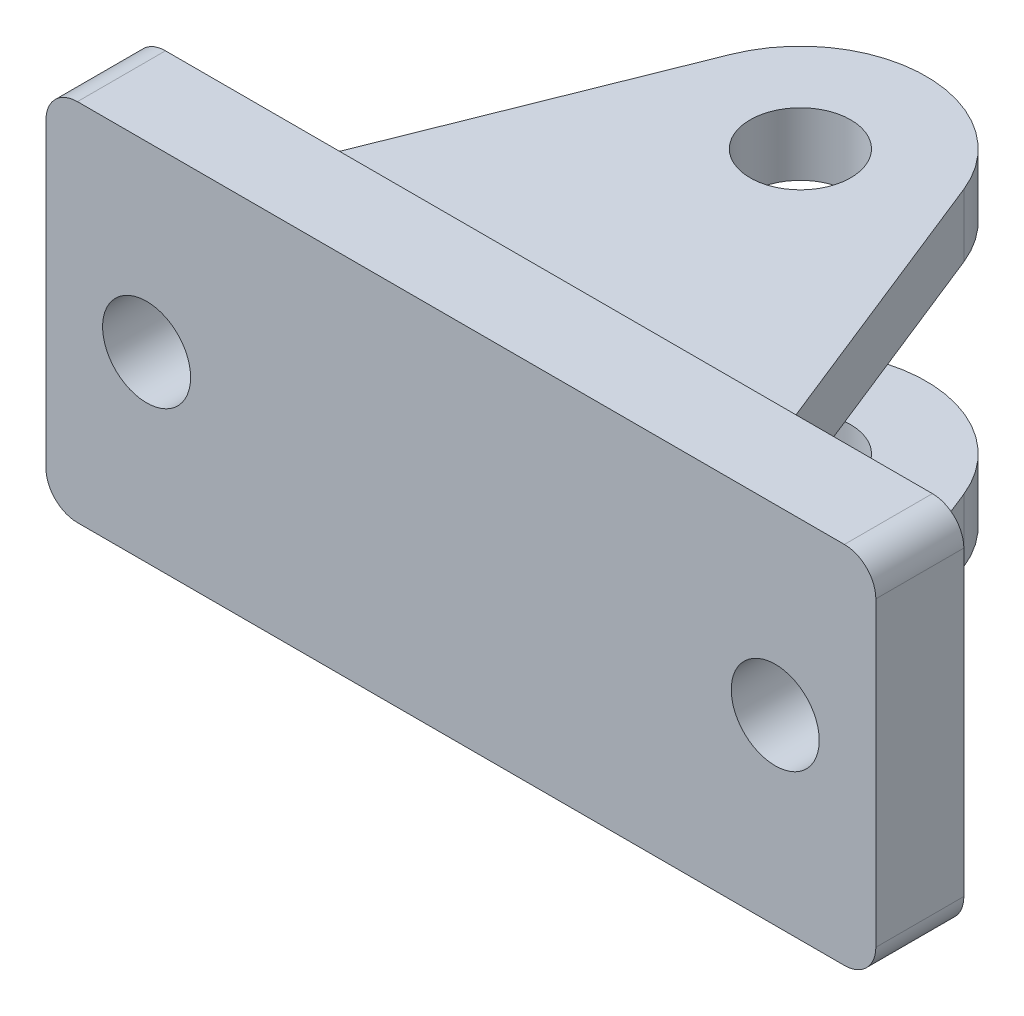
ISO-10303-21;
HEADER;
FILE_DESCRIPTION(('STEP AP214'),'2;1');
FILE_NAME('part.step','',(''),(''),'','','');
FILE_SCHEMA(('AUTOMOTIVE_DESIGN { 1 0 10303 214 1 1 1 1 }'));
ENDSEC;
DATA;
#1=APPLICATION_CONTEXT('core data for automotive mechanical design processes');
#2=APPLICATION_PROTOCOL_DEFINITION('international standard','automotive_design',2000,#1);
#3=PRODUCT_CONTEXT('',#1,'mechanical');
#4=PRODUCT('Part','Part','',(#3));
#5=PRODUCT_RELATED_PRODUCT_CATEGORY('part','',(#4));
#6=PRODUCT_DEFINITION_FORMATION('','',#4);
#7=PRODUCT_DEFINITION_CONTEXT('part definition',#1,'design');
#8=PRODUCT_DEFINITION('design','',#6,#7);
#9=PRODUCT_DEFINITION_SHAPE('','',#8);
#10=(LENGTH_UNIT() NAMED_UNIT(*) SI_UNIT(.MILLI.,.METRE.));
#11=(NAMED_UNIT(*) PLANE_ANGLE_UNIT() SI_UNIT($,.RADIAN.));
#12=(NAMED_UNIT(*) SI_UNIT($,.STERADIAN.) SOLID_ANGLE_UNIT());
#13=UNCERTAINTY_MEASURE_WITH_UNIT(LENGTH_MEASURE(1.E-05),#10,'distance_accuracy_value','');
#14=(GEOMETRIC_REPRESENTATION_CONTEXT(3) GLOBAL_UNCERTAINTY_ASSIGNED_CONTEXT((#13)) GLOBAL_UNIT_ASSIGNED_CONTEXT((#10,
#11,#12)) REPRESENTATION_CONTEXT('',''));
#15=CARTESIAN_POINT('',(0.,0.,0.));
#16=DIRECTION('',(0.,0.,1.));
#17=DIRECTION('',(1.,0.,0.));
#18=AXIS2_PLACEMENT_3D('',#15,#16,#17);
#19=CARTESIAN_POINT('',(0.,0.,0.));
#20=DIRECTION('',(0.,0.,1.));
#21=DIRECTION('',(1.,0.,0.));
#22=AXIS2_PLACEMENT_3D('',#19,#20,#21);
#23=PLANE('',#22);
#24=DIRECTION('',(-1.,0.,0.));
#25=VECTOR('',#24,1.);
#26=CARTESIAN_POINT('',(37.5,-26.,0.));
#27=LINE('',#26,#25);
#28=CARTESIAN_POINT('',(40.8878611604138,-26.,0.));
#29=VERTEX_POINT('',#28);
#30=CARTESIAN_POINT('',(-40.8878611604138,-26.,0.));
#31=VERTEX_POINT('',#30);
#32=EDGE_CURVE('E233',#29,#31,#27,.T.);
#33=ORIENTED_EDGE('',*,*,#32,.F.);
#34=DIRECTION('',(0.,-1.,0.));
#35=VECTOR('',#34,1.);
#36=CARTESIAN_POINT('',(40.8878611604138,0.,0.));
#37=LINE('',#36,#35);
#38=CARTESIAN_POINT('',(40.8878611604138,-16.,0.));
#39=VERTEX_POINT('',#38);
#40=EDGE_CURVE('E379',#29,#39,#37,.F.);
#41=ORIENTED_EDGE('',*,*,#40,.T.);
#42=DIRECTION('',(-1.,0.,0.));
#43=VECTOR('',#42,1.);
#44=CARTESIAN_POINT('',(37.5,-16.,0.));
#45=LINE('',#44,#43);
#46=CARTESIAN_POINT('',(-40.8878611604138,-16.,0.));
#47=VERTEX_POINT('',#46);
#48=EDGE_CURVE('E237',#39,#47,#45,.T.);
#49=ORIENTED_EDGE('',*,*,#48,.T.);
#50=DIRECTION('',(0.,-1.,0.));
#51=VECTOR('',#50,1.);
#52=CARTESIAN_POINT('',(-40.8878611604138,0.,0.));
#53=LINE('',#52,#51);
#54=EDGE_CURVE('E375',#47,#31,#53,.T.);
#55=ORIENTED_EDGE('',*,*,#54,.T.);
#56=EDGE_LOOP('',(#33,#41,#49,#55));
#57=FACE_BOUND('',#56,.T.);
#58=DIRECTION('',(0.,-1.,0.));
#59=VECTOR('',#58,1.);
#60=CARTESIAN_POINT('',(-66.,29.,0.));
#61=LINE('',#60,#59);
#62=CARTESIAN_POINT('',(-66.,24.,0.));
#63=VERTEX_POINT('',#62);
#64=CARTESIAN_POINT('',(-66.,-24.,0.));
#65=VERTEX_POINT('',#64);
#66=EDGE_CURVE('E313',#63,#65,#61,.T.);
#67=ORIENTED_EDGE('',*,*,#66,.F.);
#68=CARTESIAN_POINT('',(-61.,24.,0.));
#69=DIRECTION('',(0.,0.,1.));
#70=DIRECTION('',(1.,0.,0.));
#71=AXIS2_PLACEMENT_3D('',#68,#69,#70);
#72=CIRCLE('',#71,5.);
#73=CARTESIAN_POINT('',(-61.,29.,0.));
#74=VERTEX_POINT('',#73);
#75=EDGE_CURVE('E335',#63,#74,#72,.F.);
#76=ORIENTED_EDGE('',*,*,#75,.T.);
#77=DIRECTION('',(-1.,0.,0.));
#78=VECTOR('',#77,1.);
#79=CARTESIAN_POINT('',(-66.,29.,0.));
#80=LINE('',#79,#78);
#81=CARTESIAN_POINT('',(61.,29.,0.));
#82=VERTEX_POINT('',#81);
#83=EDGE_CURVE('E309',#82,#74,#80,.T.);
#84=ORIENTED_EDGE('',*,*,#83,.F.);
#85=CARTESIAN_POINT('',(61.,24.,0.));
#86=DIRECTION('',(0.,0.,1.));
#87=DIRECTION('',(1.,0.,0.));
#88=AXIS2_PLACEMENT_3D('',#85,#86,#87);
#89=CIRCLE('',#88,5.);
#90=CARTESIAN_POINT('',(66.,24.,0.));
#91=VERTEX_POINT('',#90);
#92=EDGE_CURVE('E332',#82,#91,#89,.F.);
#93=ORIENTED_EDGE('',*,*,#92,.T.);
#94=DIRECTION('',(0.,1.,0.));
#95=VECTOR('',#94,1.);
#96=CARTESIAN_POINT('',(66.,29.,0.));
#97=LINE('',#96,#95);
#98=CARTESIAN_POINT('',(66.,-24.,0.));
#99=VERTEX_POINT('',#98);
#100=EDGE_CURVE('E284',#99,#91,#97,.T.);
#101=ORIENTED_EDGE('',*,*,#100,.F.);
#102=CARTESIAN_POINT('',(61.,-24.,0.));
#103=DIRECTION('',(0.,0.,1.));
#104=DIRECTION('',(1.,0.,0.));
#105=AXIS2_PLACEMENT_3D('',#102,#103,#104);
#106=CIRCLE('',#105,5.);
#107=CARTESIAN_POINT('',(61.,-29.,0.));
#108=VERTEX_POINT('',#107);
#109=EDGE_CURVE('E329',#99,#108,#106,.F.);
#110=ORIENTED_EDGE('',*,*,#109,.T.);
#111=DIRECTION('',(1.,0.,0.));
#112=VECTOR('',#111,1.);
#113=CARTESIAN_POINT('',(-66.,-29.,0.));
#114=LINE('',#113,#112);
#115=CARTESIAN_POINT('',(-61.,-29.,0.));
#116=VERTEX_POINT('',#115);
#117=EDGE_CURVE('E293',#116,#108,#114,.T.);
#118=ORIENTED_EDGE('',*,*,#117,.F.);
#119=CARTESIAN_POINT('',(-61.,-24.,0.));
#120=DIRECTION('',(0.,0.,1.));
#121=DIRECTION('',(1.,0.,0.));
#122=AXIS2_PLACEMENT_3D('',#119,#120,#121);
#123=CIRCLE('',#122,5.);
#124=EDGE_CURVE('E326',#116,#65,#123,.F.);
#125=ORIENTED_EDGE('',*,*,#124,.T.);
#126=EDGE_LOOP('',(#67,#76,#84,#93,#101,#110,#118,#125));
#127=FACE_BOUND('',#126,.T.);
#128=CARTESIAN_POINT('',(-50.,0.,0.));
#129=DIRECTION('',(0.,0.,1.));
#130=DIRECTION('',(1.,0.,0.));
#131=AXIS2_PLACEMENT_3D('',#128,#129,#130);
#132=CIRCLE('',#131,7.);
#133=CARTESIAN_POINT('',(-43.,0.,0.));
#134=VERTEX_POINT('',#133);
#135=EDGE_CURVE('E276',#134,#134,#132,.T.);
#136=ORIENTED_EDGE('',*,*,#135,.T.);
#137=EDGE_LOOP('',(#136));
#138=FACE_BOUND('',#137,.T.);
#139=CARTESIAN_POINT('',(50.,0.,0.));
#140=DIRECTION('',(0.,0.,1.));
#141=DIRECTION('',(1.,0.,0.));
#142=AXIS2_PLACEMENT_3D('',#139,#140,#141);
#143=CIRCLE('',#142,7.);
#144=CARTESIAN_POINT('',(57.,0.,0.));
#145=VERTEX_POINT('',#144);
#146=EDGE_CURVE('E268',#145,#145,#143,.T.);
#147=ORIENTED_EDGE('',*,*,#146,.T.);
#148=EDGE_LOOP('',(#147));
#149=FACE_BOUND('',#148,.T.);
#150=DIRECTION('',(0.,1.,0.));
#151=VECTOR('',#150,1.);
#152=CARTESIAN_POINT('',(40.8878611604138,26.,0.));
#153=LINE('',#152,#151);
#154=CARTESIAN_POINT('',(40.8878611604138,16.,0.));
#155=VERTEX_POINT('',#154);
#156=CARTESIAN_POINT('',(40.8878611604138,26.,0.));
#157=VERTEX_POINT('',#156);
#158=EDGE_CURVE('E404',#155,#157,#153,.T.);
#159=ORIENTED_EDGE('',*,*,#158,.T.);
#160=DIRECTION('',(-1.,0.,0.));
#161=VECTOR('',#160,1.);
#162=CARTESIAN_POINT('',(37.5,26.,0.));
#163=LINE('',#162,#161);
#164=CARTESIAN_POINT('',(-40.8878611604138,26.,0.));
#165=VERTEX_POINT('',#164);
#166=EDGE_CURVE('E215',#157,#165,#163,.T.);
#167=ORIENTED_EDGE('',*,*,#166,.T.);
#168=DIRECTION('',(0.,1.,0.));
#169=VECTOR('',#168,1.);
#170=CARTESIAN_POINT('',(-40.8878611604138,16.,0.));
#171=LINE('',#170,#169);
#172=CARTESIAN_POINT('',(-40.8878611604138,16.,0.));
#173=VERTEX_POINT('',#172);
#174=EDGE_CURVE('E400',#165,#173,#171,.F.);
#175=ORIENTED_EDGE('',*,*,#174,.T.);
#176=DIRECTION('',(-1.,0.,0.));
#177=VECTOR('',#176,1.);
#178=CARTESIAN_POINT('',(37.5,16.,0.));
#179=LINE('',#178,#177);
#180=EDGE_CURVE('E206',#155,#173,#179,.T.);
#181=ORIENTED_EDGE('',*,*,#180,.F.);
#182=EDGE_LOOP('',(#159,#167,#175,#181));
#183=FACE_BOUND('',#182,.T.);
#184=ADVANCED_FACE('F41',(#57,#127,#138,#149,#183),#23,.F.);
#185=CARTESIAN_POINT('',(0.,0.,14.));
#186=DIRECTION('',(0.,0.,1.));
#187=DIRECTION('',(1.,0.,0.));
#188=AXIS2_PLACEMENT_3D('',#185,#186,#187);
#189=PLANE('',#188);
#190=CARTESIAN_POINT('',(-50.,0.,14.));
#191=DIRECTION('',(0.,0.,1.));
#192=DIRECTION('',(1.,0.,0.));
#193=AXIS2_PLACEMENT_3D('',#190,#191,#192);
#194=CIRCLE('',#193,7.);
#195=CARTESIAN_POINT('',(-43.,0.,14.));
#196=VERTEX_POINT('',#195);
#197=EDGE_CURVE('E280',#196,#196,#194,.T.);
#198=ORIENTED_EDGE('',*,*,#197,.F.);
#199=EDGE_LOOP('',(#198));
#200=FACE_BOUND('',#199,.T.);
#201=DIRECTION('',(-1.,0.,0.));
#202=VECTOR('',#201,1.);
#203=CARTESIAN_POINT('',(-66.,29.,14.));
#204=LINE('',#203,#202);
#205=CARTESIAN_POINT('',(61.,29.,14.));
#206=VERTEX_POINT('',#205);
#207=CARTESIAN_POINT('',(-61.,29.,14.));
#208=VERTEX_POINT('',#207);
#209=EDGE_CURVE('E292',#206,#208,#204,.T.);
#210=ORIENTED_EDGE('',*,*,#209,.T.);
#211=CARTESIAN_POINT('',(-61.,24.,14.));
#212=DIRECTION('',(0.,0.,1.));
#213=DIRECTION('',(1.,0.,0.));
#214=AXIS2_PLACEMENT_3D('',#211,#212,#213);
#215=CIRCLE('',#214,5.);
#216=CARTESIAN_POINT('',(-66.,24.,14.));
#217=VERTEX_POINT('',#216);
#218=EDGE_CURVE('E354',#208,#217,#215,.T.);
#219=ORIENTED_EDGE('',*,*,#218,.T.);
#220=DIRECTION('',(0.,-1.,0.));
#221=VECTOR('',#220,1.);
#222=CARTESIAN_POINT('',(-66.,29.,14.));
#223=LINE('',#222,#221);
#224=CARTESIAN_POINT('',(-66.,-24.,14.));
#225=VERTEX_POINT('',#224);
#226=EDGE_CURVE('E297',#217,#225,#223,.T.);
#227=ORIENTED_EDGE('',*,*,#226,.T.);
#228=CARTESIAN_POINT('',(-61.,-24.,14.));
#229=DIRECTION('',(0.,0.,1.));
#230=DIRECTION('',(1.,0.,0.));
#231=AXIS2_PLACEMENT_3D('',#228,#229,#230);
#232=CIRCLE('',#231,5.);
#233=CARTESIAN_POINT('',(-61.,-29.,14.));
#234=VERTEX_POINT('',#233);
#235=EDGE_CURVE('E345',#225,#234,#232,.T.);
#236=ORIENTED_EDGE('',*,*,#235,.T.);
#237=DIRECTION('',(1.,0.,0.));
#238=VECTOR('',#237,1.);
#239=CARTESIAN_POINT('',(-66.,-29.,14.));
#240=LINE('',#239,#238);
#241=CARTESIAN_POINT('',(61.,-29.,14.));
#242=VERTEX_POINT('',#241);
#243=EDGE_CURVE('E301',#234,#242,#240,.T.);
#244=ORIENTED_EDGE('',*,*,#243,.T.);
#245=CARTESIAN_POINT('',(61.,-24.,14.));
#246=DIRECTION('',(0.,0.,1.));
#247=DIRECTION('',(1.,0.,0.));
#248=AXIS2_PLACEMENT_3D('',#245,#246,#247);
#249=CIRCLE('',#248,5.);
#250=CARTESIAN_POINT('',(66.,-24.,14.));
#251=VERTEX_POINT('',#250);
#252=EDGE_CURVE('E348',#242,#251,#249,.T.);
#253=ORIENTED_EDGE('',*,*,#252,.T.);
#254=DIRECTION('',(0.,1.,0.));
#255=VECTOR('',#254,1.);
#256=CARTESIAN_POINT('',(66.,29.,14.));
#257=LINE('',#256,#255);
#258=CARTESIAN_POINT('',(66.,24.,14.));
#259=VERTEX_POINT('',#258);
#260=EDGE_CURVE('E288',#251,#259,#257,.T.);
#261=ORIENTED_EDGE('',*,*,#260,.T.);
#262=CARTESIAN_POINT('',(61.,24.,14.));
#263=DIRECTION('',(0.,0.,1.));
#264=DIRECTION('',(1.,0.,0.));
#265=AXIS2_PLACEMENT_3D('',#262,#263,#264);
#266=CIRCLE('',#265,5.);
#267=EDGE_CURVE('E351',#259,#206,#266,.T.);
#268=ORIENTED_EDGE('',*,*,#267,.T.);
#269=EDGE_LOOP('',(#210,#219,#227,#236,#244,#253,#261,#268));
#270=FACE_BOUND('',#269,.T.);
#271=CARTESIAN_POINT('',(50.,0.,14.));
#272=DIRECTION('',(0.,0.,1.));
#273=DIRECTION('',(1.,0.,0.));
#274=AXIS2_PLACEMENT_3D('',#271,#272,#273);
#275=CIRCLE('',#274,7.);
#276=CARTESIAN_POINT('',(57.,0.,14.));
#277=VERTEX_POINT('',#276);
#278=EDGE_CURVE('E272',#277,#277,#275,.T.);
#279=ORIENTED_EDGE('',*,*,#278,.F.);
#280=EDGE_LOOP('',(#279));
#281=FACE_BOUND('',#280,.T.);
#282=ADVANCED_FACE('F438',(#200,#270,#281),#189,.T.);
#283=CARTESIAN_POINT('',(66.,29.,14.));
#284=DIRECTION('',(-1.,0.,0.));
#285=DIRECTION('',(0.,0.,1.));
#286=AXIS2_PLACEMENT_3D('',#283,#284,#285);
#287=PLANE('',#286);
#288=ORIENTED_EDGE('',*,*,#100,.T.);
#289=DIRECTION('',(0.,0.,-1.));
#290=VECTOR('',#289,1.);
#291=CARTESIAN_POINT('',(66.,24.,14.));
#292=LINE('',#291,#290);
#293=EDGE_CURVE('E361',#91,#259,#292,.F.);
#294=ORIENTED_EDGE('',*,*,#293,.T.);
#295=ORIENTED_EDGE('',*,*,#260,.F.);
#296=DIRECTION('',(0.,0.,-1.));
#297=VECTOR('',#296,1.);
#298=CARTESIAN_POINT('',(66.,-24.,14.));
#299=LINE('',#298,#297);
#300=EDGE_CURVE('E357',#251,#99,#299,.T.);
#301=ORIENTED_EDGE('',*,*,#300,.T.);
#302=EDGE_LOOP('',(#288,#294,#295,#301));
#303=FACE_BOUND('',#302,.T.);
#304=ADVANCED_FACE('F444',(#303),#287,.F.);
#305=CARTESIAN_POINT('',(-66.,29.,14.));
#306=DIRECTION('',(0.,-1.,0.));
#307=DIRECTION('',(1.,0.,0.));
#308=AXIS2_PLACEMENT_3D('',#305,#306,#307);
#309=PLANE('',#308);
#310=ORIENTED_EDGE('',*,*,#83,.T.);
#311=DIRECTION('',(0.,0.,-1.));
#312=VECTOR('',#311,1.);
#313=CARTESIAN_POINT('',(-61.,29.,14.));
#314=LINE('',#313,#312);
#315=EDGE_CURVE('E342',#74,#208,#314,.F.);
#316=ORIENTED_EDGE('',*,*,#315,.T.);
#317=ORIENTED_EDGE('',*,*,#209,.F.);
#318=DIRECTION('',(0.,0.,-1.));
#319=VECTOR('',#318,1.);
#320=CARTESIAN_POINT('',(61.,29.,14.));
#321=LINE('',#320,#319);
#322=EDGE_CURVE('E338',#206,#82,#321,.T.);
#323=ORIENTED_EDGE('',*,*,#322,.T.);
#324=EDGE_LOOP('',(#310,#316,#317,#323));
#325=FACE_BOUND('',#324,.T.);
#326=ADVANCED_FACE('F458',(#325),#309,.F.);
#327=CARTESIAN_POINT('',(-66.,29.,14.));
#328=DIRECTION('',(1.,0.,0.));
#329=DIRECTION('',(0.,0.,-1.));
#330=AXIS2_PLACEMENT_3D('',#327,#328,#329);
#331=PLANE('',#330);
#332=ORIENTED_EDGE('',*,*,#226,.F.);
#333=DIRECTION('',(0.,0.,-1.));
#334=VECTOR('',#333,1.);
#335=CARTESIAN_POINT('',(-66.,24.,14.));
#336=LINE('',#335,#334);
#337=EDGE_CURVE('E322',#217,#63,#336,.T.);
#338=ORIENTED_EDGE('',*,*,#337,.T.);
#339=ORIENTED_EDGE('',*,*,#66,.T.);
#340=DIRECTION('',(0.,0.,-1.));
#341=VECTOR('',#340,1.);
#342=CARTESIAN_POINT('',(-66.,-24.,14.));
#343=LINE('',#342,#341);
#344=EDGE_CURVE('E305',#65,#225,#343,.F.);
#345=ORIENTED_EDGE('',*,*,#344,.T.);
#346=EDGE_LOOP('',(#332,#338,#339,#345));
#347=FACE_BOUND('',#346,.T.);
#348=ADVANCED_FACE('F454',(#347),#331,.F.);
#349=CARTESIAN_POINT('',(-66.,-29.,14.));
#350=DIRECTION('',(0.,1.,0.));
#351=DIRECTION('',(0.,0.,1.));
#352=AXIS2_PLACEMENT_3D('',#349,#350,#351);
#353=PLANE('',#352);
#354=ORIENTED_EDGE('',*,*,#117,.T.);
#355=DIRECTION('',(0.,0.,-1.));
#356=VECTOR('',#355,1.);
#357=CARTESIAN_POINT('',(61.,-29.,14.));
#358=LINE('',#357,#356);
#359=EDGE_CURVE('E368',#108,#242,#358,.F.);
#360=ORIENTED_EDGE('',*,*,#359,.T.);
#361=ORIENTED_EDGE('',*,*,#243,.F.);
#362=DIRECTION('',(0.,0.,-1.));
#363=VECTOR('',#362,1.);
#364=CARTESIAN_POINT('',(-61.,-29.,14.));
#365=LINE('',#364,#363);
#366=EDGE_CURVE('E364',#234,#116,#365,.T.);
#367=ORIENTED_EDGE('',*,*,#366,.T.);
#368=EDGE_LOOP('',(#354,#360,#361,#367));
#369=FACE_BOUND('',#368,.T.);
#370=ADVANCED_FACE('F450',(#369),#353,.F.);
#371=CARTESIAN_POINT('',(-50.,0.,14.));
#372=DIRECTION('',(0.,0.,-1.));
#373=DIRECTION('',(-1.,0.,0.));
#374=AXIS2_PLACEMENT_3D('',#371,#372,#373);
#375=CYLINDRICAL_SURFACE('',#374,7.);
#376=ORIENTED_EDGE('',*,*,#197,.T.);
#377=EDGE_LOOP('',(#376));
#378=FACE_BOUND('',#377,.T.);
#379=ORIENTED_EDGE('',*,*,#135,.F.);
#380=EDGE_LOOP('',(#379));
#381=FACE_BOUND('',#380,.T.);
#382=ADVANCED_FACE('F453',(#378,#381),#375,.F.);
#383=CARTESIAN_POINT('',(50.,0.,14.));
#384=DIRECTION('',(0.,0.,-1.));
#385=DIRECTION('',(-1.,0.,0.));
#386=AXIS2_PLACEMENT_3D('',#383,#384,#385);
#387=CYLINDRICAL_SURFACE('',#386,7.);
#388=ORIENTED_EDGE('',*,*,#278,.T.);
#389=EDGE_LOOP('',(#388));
#390=FACE_BOUND('',#389,.T.);
#391=ORIENTED_EDGE('',*,*,#146,.F.);
#392=EDGE_LOOP('',(#391));
#393=FACE_BOUND('',#392,.T.);
#394=ADVANCED_FACE('F470',(#390,#393),#387,.F.);
#395=CARTESIAN_POINT('',(-61.,24.,14.));
#396=DIRECTION('',(0.,0.,-1.));
#397=DIRECTION('',(-1.,0.,0.));
#398=AXIS2_PLACEMENT_3D('',#395,#396,#397);
#399=CYLINDRICAL_SURFACE('',#398,5.);
#400=ORIENTED_EDGE('',*,*,#218,.F.);
#401=ORIENTED_EDGE('',*,*,#315,.F.);
#402=ORIENTED_EDGE('',*,*,#75,.F.);
#403=ORIENTED_EDGE('',*,*,#337,.F.);
#404=EDGE_LOOP('',(#400,#401,#402,#403));
#405=FACE_BOUND('',#404,.T.);
#406=ADVANCED_FACE('F466',(#405),#399,.T.);
#407=CARTESIAN_POINT('',(61.,24.,14.));
#408=DIRECTION('',(0.,0.,-1.));
#409=DIRECTION('',(-1.,0.,0.));
#410=AXIS2_PLACEMENT_3D('',#407,#408,#409);
#411=CYLINDRICAL_SURFACE('',#410,5.);
#412=ORIENTED_EDGE('',*,*,#267,.F.);
#413=ORIENTED_EDGE('',*,*,#293,.F.);
#414=ORIENTED_EDGE('',*,*,#92,.F.);
#415=ORIENTED_EDGE('',*,*,#322,.F.);
#416=EDGE_LOOP('',(#412,#413,#414,#415));
#417=FACE_BOUND('',#416,.T.);
#418=ADVANCED_FACE('F469',(#417),#411,.T.);
#419=CARTESIAN_POINT('',(61.,-24.,14.));
#420=DIRECTION('',(0.,0.,-1.));
#421=DIRECTION('',(-1.,0.,0.));
#422=AXIS2_PLACEMENT_3D('',#419,#420,#421);
#423=CYLINDRICAL_SURFACE('',#422,5.);
#424=ORIENTED_EDGE('',*,*,#252,.F.);
#425=ORIENTED_EDGE('',*,*,#359,.F.);
#426=ORIENTED_EDGE('',*,*,#109,.F.);
#427=ORIENTED_EDGE('',*,*,#300,.F.);
#428=EDGE_LOOP('',(#424,#425,#426,#427));
#429=FACE_BOUND('',#428,.T.);
#430=ADVANCED_FACE('F474',(#429),#423,.T.);
#431=CARTESIAN_POINT('',(-61.,-24.,14.));
#432=DIRECTION('',(0.,0.,-1.));
#433=DIRECTION('',(-1.,0.,0.));
#434=AXIS2_PLACEMENT_3D('',#431,#432,#433);
#435=CYLINDRICAL_SURFACE('',#434,5.);
#436=ORIENTED_EDGE('',*,*,#235,.F.);
#437=ORIENTED_EDGE('',*,*,#344,.F.);
#438=ORIENTED_EDGE('',*,*,#124,.F.);
#439=ORIENTED_EDGE('',*,*,#366,.F.);
#440=EDGE_LOOP('',(#436,#437,#438,#439));
#441=FACE_BOUND('',#440,.T.);
#442=ADVANCED_FACE('F478',(#441),#435,.T.);
#443=CARTESIAN_POINT('',(37.5,-16.,0.));
#444=DIRECTION('',(0.92875103057504,0.,-0.3707040911641));
#445=DIRECTION('',(-0.3707040911641,0.,-0.92875103057504));
#446=AXIS2_PLACEMENT_3D('',#443,#444,#445);
#447=PLANE('',#446);
#448=DIRECTION('',(0.3707040911641,0.,0.92875103057504));
#449=VECTOR('',#448,1.);
#450=CARTESIAN_POINT('',(37.5,-16.,0.));
#451=LINE('',#450,#449);
#452=CARTESIAN_POINT('',(18.5750206115008,-16.,-47.414081823282));
#453=VERTEX_POINT('',#452);
#454=CARTESIAN_POINT('',(36.2441060075386,-16.,-3.1464795441795));
#455=VERTEX_POINT('',#454);
#456=EDGE_CURVE('E248',#453,#455,#451,.T.);
#457=ORIENTED_EDGE('',*,*,#456,.T.);
#458=DIRECTION('',(0.,-1.,0.));
#459=VECTOR('',#458,1.);
#460=CARTESIAN_POINT('',(36.2441060075386,-16.,-3.1464795441795));
#461=LINE('',#460,#459);
#462=CARTESIAN_POINT('',(36.2441060075386,-26.,-3.1464795441795));
#463=VERTEX_POINT('',#462);
#464=EDGE_CURVE('E371',#455,#463,#461,.T.);
#465=ORIENTED_EDGE('',*,*,#464,.T.);
#466=DIRECTION('',(0.3707040911641,0.,0.92875103057504));
#467=VECTOR('',#466,1.);
#468=CARTESIAN_POINT('',(37.5,-26.,0.));
#469=LINE('',#468,#467);
#470=CARTESIAN_POINT('',(18.5750206115008,-26.,-47.414081823282));
#471=VERTEX_POINT('',#470);
#472=EDGE_CURVE('E241',#471,#463,#469,.T.);
#473=ORIENTED_EDGE('',*,*,#472,.F.);
#474=DIRECTION('',(0.,-1.,0.));
#475=VECTOR('',#474,1.);
#476=CARTESIAN_POINT('',(18.5750206115008,-16.,-47.414081823282));
#477=LINE('',#476,#475);
#478=EDGE_CURVE('E265',#453,#471,#477,.T.);
#479=ORIENTED_EDGE('',*,*,#478,.F.);
#480=EDGE_LOOP('',(#457,#465,#473,#479));
#481=FACE_BOUND('',#480,.T.);
#482=ADVANCED_FACE('F482',(#481),#447,.T.);
#483=CARTESIAN_POINT('',(0.,-16.,-40.));
#484=DIRECTION('',(0.,-1.,0.));
#485=DIRECTION('',(0.,0.,-1.));
#486=AXIS2_PLACEMENT_3D('',#483,#484,#485);
#487=CYLINDRICAL_SURFACE('',#486,20.);
#488=CARTESIAN_POINT('',(0.,-26.,-40.));
#489=DIRECTION('',(0.,-1.,0.));
#490=DIRECTION('',(0.,0.,-1.));
#491=AXIS2_PLACEMENT_3D('',#488,#489,#490);
#492=CIRCLE('',#491,20.);
#493=CARTESIAN_POINT('',(-18.5750206115008,-26.,-47.414081823282));
#494=VERTEX_POINT('',#493);
#495=EDGE_CURVE('E258',#494,#471,#492,.T.);
#496=ORIENTED_EDGE('',*,*,#495,.F.);
#497=DIRECTION('',(0.,-1.,0.));
#498=VECTOR('',#497,1.);
#499=CARTESIAN_POINT('',(-18.5750206115008,-16.,-47.414081823282));
#500=LINE('',#499,#498);
#501=CARTESIAN_POINT('',(-18.5750206115008,-16.,-47.414081823282));
#502=VERTEX_POINT('',#501);
#503=EDGE_CURVE('E252',#502,#494,#500,.T.);
#504=ORIENTED_EDGE('',*,*,#503,.F.);
#505=CARTESIAN_POINT('',(0.,-16.,-40.));
#506=DIRECTION('',(0.,-1.,0.));
#507=DIRECTION('',(0.,0.,-1.));
#508=AXIS2_PLACEMENT_3D('',#505,#506,#507);
#509=CIRCLE('',#508,20.);
#510=EDGE_CURVE('E244',#502,#453,#509,.T.);
#511=ORIENTED_EDGE('',*,*,#510,.T.);
#512=ORIENTED_EDGE('',*,*,#478,.T.);
#513=EDGE_LOOP('',(#496,#504,#511,#512));
#514=FACE_BOUND('',#513,.T.);
#515=ADVANCED_FACE('F510',(#514),#487,.T.);
#516=CARTESIAN_POINT('',(-18.5750206115008,-16.,-47.414081823282));
#517=DIRECTION('',(-0.92875103057504,0.,-0.3707040911641));
#518=DIRECTION('',(-0.3707040911641,0.,0.92875103057504));
#519=AXIS2_PLACEMENT_3D('',#516,#517,#518);
#520=PLANE('',#519);
#521=DIRECTION('',(0.3707040911641,0.,-0.92875103057504));
#522=VECTOR('',#521,1.);
#523=CARTESIAN_POINT('',(-18.5750206115008,-26.,-47.414081823282));
#524=LINE('',#523,#522);
#525=CARTESIAN_POINT('',(-36.2441060075386,-26.,-3.14647954417951));
#526=VERTEX_POINT('',#525);
#527=EDGE_CURVE('E255',#526,#494,#524,.T.);
#528=ORIENTED_EDGE('',*,*,#527,.F.);
#529=DIRECTION('',(0.,-1.,0.));
#530=VECTOR('',#529,1.);
#531=CARTESIAN_POINT('',(-36.2441060075386,-16.,-3.14647954417949));
#532=LINE('',#531,#530);
#533=CARTESIAN_POINT('',(-36.2441060075386,-16.,-3.14647954417951));
#534=VERTEX_POINT('',#533);
#535=EDGE_CURVE('E383',#526,#534,#532,.F.);
#536=ORIENTED_EDGE('',*,*,#535,.T.);
#537=DIRECTION('',(0.3707040911641,0.,-0.92875103057504));
#538=VECTOR('',#537,1.);
#539=CARTESIAN_POINT('',(-18.5750206115008,-16.,-47.414081823282));
#540=LINE('',#539,#538);
#541=EDGE_CURVE('E240',#534,#502,#540,.T.);
#542=ORIENTED_EDGE('',*,*,#541,.T.);
#543=ORIENTED_EDGE('',*,*,#503,.T.);
#544=EDGE_LOOP('',(#528,#536,#542,#543));
#545=FACE_BOUND('',#544,.T.);
#546=ADVANCED_FACE('F507',(#545),#520,.T.);
#547=CARTESIAN_POINT('',(0.,-16.,-40.));
#548=DIRECTION('',(0.,-1.,0.));
#549=DIRECTION('',(0.,0.,-1.));
#550=AXIS2_PLACEMENT_3D('',#547,#548,#549);
#551=PLANE('',#550);
#552=CARTESIAN_POINT('',(0.,-16.,-40.));
#553=DIRECTION('',(0.,-1.,0.));
#554=DIRECTION('',(0.,0.,-1.));
#555=AXIS2_PLACEMENT_3D('',#552,#553,#554);
#556=CIRCLE('',#555,8.);
#557=CARTESIAN_POINT('',(0.,-16.,-48.));
#558=VERTEX_POINT('',#557);
#559=EDGE_CURVE('E229',#558,#558,#556,.T.);
#560=ORIENTED_EDGE('',*,*,#559,.T.);
#561=EDGE_LOOP('',(#560));
#562=FACE_BOUND('',#561,.T.);
#563=ORIENTED_EDGE('',*,*,#48,.F.);
#564=CARTESIAN_POINT('',(40.8878611604138,-16.,-5.));
#565=DIRECTION('',(0.,-1.,0.));
#566=DIRECTION('',(0.,0.,-1.));
#567=AXIS2_PLACEMENT_3D('',#564,#565,#566);
#568=CIRCLE('',#567,5.);
#569=EDGE_CURVE('E390',#39,#455,#568,.T.);
#570=ORIENTED_EDGE('',*,*,#569,.T.);
#571=ORIENTED_EDGE('',*,*,#456,.F.);
#572=ORIENTED_EDGE('',*,*,#510,.F.);
#573=ORIENTED_EDGE('',*,*,#541,.F.);
#574=CARTESIAN_POINT('',(-40.8878611604138,-16.,-5.));
#575=DIRECTION('',(0.,-1.,0.));
#576=DIRECTION('',(0.,0.,-1.));
#577=AXIS2_PLACEMENT_3D('',#574,#575,#576);
#578=CIRCLE('',#577,5.);
#579=EDGE_CURVE('E396',#534,#47,#578,.T.);
#580=ORIENTED_EDGE('',*,*,#579,.T.);
#581=EDGE_LOOP('',(#563,#570,#571,#572,#573,#580));
#582=FACE_BOUND('',#581,.T.);
#583=ADVANCED_FACE('F501',(#562,#582),#551,.F.);
#584=CARTESIAN_POINT('',(0.,-26.,-40.));
#585=DIRECTION('',(0.,-1.,0.));
#586=DIRECTION('',(0.,0.,-1.));
#587=AXIS2_PLACEMENT_3D('',#584,#585,#586);
#588=PLANE('',#587);
#589=CARTESIAN_POINT('',(0.,-26.,-40.));
#590=DIRECTION('',(0.,-1.,0.));
#591=DIRECTION('',(0.,0.,-1.));
#592=AXIS2_PLACEMENT_3D('',#589,#590,#591);
#593=CIRCLE('',#592,8.);
#594=CARTESIAN_POINT('',(0.,-26.,-48.));
#595=VERTEX_POINT('',#594);
#596=EDGE_CURVE('E227',#595,#595,#593,.T.);
#597=ORIENTED_EDGE('',*,*,#596,.F.);
#598=EDGE_LOOP('',(#597));
#599=FACE_BOUND('',#598,.T.);
#600=ORIENTED_EDGE('',*,*,#32,.T.);
#601=CARTESIAN_POINT('',(-40.8878611604138,-26.,-5.));
#602=DIRECTION('',(0.,-1.,0.));
#603=DIRECTION('',(0.,0.,-1.));
#604=AXIS2_PLACEMENT_3D('',#601,#602,#603);
#605=CIRCLE('',#604,5.);
#606=EDGE_CURVE('E393',#31,#526,#605,.F.);
#607=ORIENTED_EDGE('',*,*,#606,.T.);
#608=ORIENTED_EDGE('',*,*,#527,.T.);
#609=ORIENTED_EDGE('',*,*,#495,.T.);
#610=ORIENTED_EDGE('',*,*,#472,.T.);
#611=CARTESIAN_POINT('',(40.8878611604138,-26.,-5.));
#612=DIRECTION('',(0.,-1.,0.));
#613=DIRECTION('',(0.,0.,-1.));
#614=AXIS2_PLACEMENT_3D('',#611,#612,#613);
#615=CIRCLE('',#614,5.);
#616=EDGE_CURVE('E386',#463,#29,#615,.F.);
#617=ORIENTED_EDGE('',*,*,#616,.T.);
#618=EDGE_LOOP('',(#600,#607,#608,#609,#610,#617));
#619=FACE_BOUND('',#618,.T.);
#620=ADVANCED_FACE('F513',(#599,#619),#588,.T.);
#621=CARTESIAN_POINT('',(0.,-16.,-40.));
#622=DIRECTION('',(0.,-1.,0.));
#623=DIRECTION('',(0.,0.,-1.));
#624=AXIS2_PLACEMENT_3D('',#621,#622,#623);
#625=CYLINDRICAL_SURFACE('',#624,8.);
#626=ORIENTED_EDGE('',*,*,#559,.F.);
#627=EDGE_LOOP('',(#626));
#628=FACE_BOUND('',#627,.T.);
#629=ORIENTED_EDGE('',*,*,#596,.T.);
#630=EDGE_LOOP('',(#629));
#631=FACE_BOUND('',#630,.T.);
#632=ADVANCED_FACE('F487',(#628,#631),#625,.F.);
#633=CARTESIAN_POINT('',(40.8878611604138,-16.,-5.));
#634=DIRECTION('',(0.,-1.,0.));
#635=DIRECTION('',(0.,0.,-1.));
#636=AXIS2_PLACEMENT_3D('',#633,#634,#635);
#637=CYLINDRICAL_SURFACE('',#636,5.);
#638=ORIENTED_EDGE('',*,*,#569,.F.);
#639=ORIENTED_EDGE('',*,*,#40,.F.);
#640=ORIENTED_EDGE('',*,*,#616,.F.);
#641=ORIENTED_EDGE('',*,*,#464,.F.);
#642=EDGE_LOOP('',(#638,#639,#640,#641));
#643=FACE_BOUND('',#642,.T.);
#644=ADVANCED_FACE('F484',(#643),#637,.F.);
#645=CARTESIAN_POINT('',(-40.8878611604138,0.,-5.));
#646=DIRECTION('',(0.,-1.,0.));
#647=DIRECTION('',(0.,0.,-1.));
#648=AXIS2_PLACEMENT_3D('',#645,#646,#647);
#649=CYLINDRICAL_SURFACE('',#648,5.);
#650=ORIENTED_EDGE('',*,*,#579,.F.);
#651=ORIENTED_EDGE('',*,*,#535,.F.);
#652=ORIENTED_EDGE('',*,*,#606,.F.);
#653=ORIENTED_EDGE('',*,*,#54,.F.);
#654=EDGE_LOOP('',(#650,#651,#652,#653));
#655=FACE_BOUND('',#654,.T.);
#656=ADVANCED_FACE('F486',(#655),#649,.F.);
#657=CARTESIAN_POINT('',(0.,16.,-40.));
#658=DIRECTION('',(0.,1.,0.));
#659=DIRECTION('',(0.,0.,-1.));
#660=AXIS2_PLACEMENT_3D('',#657,#658,#659);
#661=PLANE('',#660);
#662=ORIENTED_EDGE('',*,*,#180,.T.);
#663=CARTESIAN_POINT('',(-40.8878611604138,16.,-5.));
#664=DIRECTION('',(0.,1.,0.));
#665=DIRECTION('',(0.,0.,1.));
#666=AXIS2_PLACEMENT_3D('',#663,#664,#665);
#667=CIRCLE('',#666,5.);
#668=CARTESIAN_POINT('',(-36.2441060075386,16.,-3.14647954417951));
#669=VERTEX_POINT('',#668);
#670=EDGE_CURVE('E11',#173,#669,#667,.T.);
#671=ORIENTED_EDGE('',*,*,#670,.T.);
#672=DIRECTION('',(0.3707040911641,0.,-0.92875103057504));
#673=VECTOR('',#672,1.);
#674=CARTESIAN_POINT('',(-18.5750206115008,16.,-47.414081823282));
#675=LINE('',#674,#673);
#676=CARTESIAN_POINT('',(-18.5750206115008,16.,-47.414081823282));
#677=VERTEX_POINT('',#676);
#678=EDGE_CURVE('E185',#669,#677,#675,.T.);
#679=ORIENTED_EDGE('',*,*,#678,.T.);
#680=CARTESIAN_POINT('',(0.,16.,-40.));
#681=DIRECTION('',(0.,-1.,0.));
#682=DIRECTION('',(0.,0.,-1.));
#683=AXIS2_PLACEMENT_3D('',#680,#681,#682);
#684=CIRCLE('',#683,20.);
#685=CARTESIAN_POINT('',(18.5750206115008,16.,-47.414081823282));
#686=VERTEX_POINT('',#685);
#687=EDGE_CURVE('E177',#677,#686,#684,.T.);
#688=ORIENTED_EDGE('',*,*,#687,.T.);
#689=DIRECTION('',(0.3707040911641,0.,0.92875103057504));
#690=VECTOR('',#689,1.);
#691=CARTESIAN_POINT('',(37.5,16.,0.));
#692=LINE('',#691,#690);
#693=CARTESIAN_POINT('',(36.2441060075386,16.,-3.1464795441795));
#694=VERTEX_POINT('',#693);
#695=EDGE_CURVE('E183',#686,#694,#692,.T.);
#696=ORIENTED_EDGE('',*,*,#695,.T.);
#697=CARTESIAN_POINT('',(40.8878611604138,16.,-5.));
#698=DIRECTION('',(0.,1.,0.));
#699=DIRECTION('',(0.,0.,1.));
#700=AXIS2_PLACEMENT_3D('',#697,#698,#699);
#701=CIRCLE('',#700,5.);
#702=EDGE_CURVE('E416',#694,#155,#701,.T.);
#703=ORIENTED_EDGE('',*,*,#702,.T.);
#704=EDGE_LOOP('',(#662,#671,#679,#688,#696,#703));
#705=FACE_BOUND('',#704,.T.);
#706=CARTESIAN_POINT('',(0.,16.,-40.));
#707=DIRECTION('',(0.,-1.,0.));
#708=DIRECTION('',(0.,0.,-1.));
#709=AXIS2_PLACEMENT_3D('',#706,#707,#708);
#710=CIRCLE('',#709,8.);
#711=CARTESIAN_POINT('',(0.,16.,-48.));
#712=VERTEX_POINT('',#711);
#713=EDGE_CURVE('E219',#712,#712,#710,.T.);
#714=ORIENTED_EDGE('',*,*,#713,.F.);
#715=EDGE_LOOP('',(#714));
#716=FACE_BOUND('',#715,.T.);
#717=ADVANCED_FACE('F179',(#705,#716),#661,.F.);
#718=CARTESIAN_POINT('',(0.,26.,-40.));
#719=DIRECTION('',(0.,1.,0.));
#720=DIRECTION('',(0.,0.,-1.));
#721=AXIS2_PLACEMENT_3D('',#718,#719,#720);
#722=PLANE('',#721);
#723=ORIENTED_EDGE('',*,*,#166,.F.);
#724=CARTESIAN_POINT('',(40.8878611604138,26.,-5.));
#725=DIRECTION('',(0.,1.,0.));
#726=DIRECTION('',(0.,0.,1.));
#727=AXIS2_PLACEMENT_3D('',#724,#725,#726);
#728=CIRCLE('',#727,5.);
#729=CARTESIAN_POINT('',(36.2441060075386,26.,-3.1464795441795));
#730=VERTEX_POINT('',#729);
#731=EDGE_CURVE('E413',#157,#730,#728,.F.);
#732=ORIENTED_EDGE('',*,*,#731,.T.);
#733=DIRECTION('',(0.3707040911641,0.,0.92875103057504));
#734=VECTOR('',#733,1.);
#735=CARTESIAN_POINT('',(37.5,26.,0.));
#736=LINE('',#735,#734);
#737=CARTESIAN_POINT('',(18.5750206115008,26.,-47.414081823282));
#738=VERTEX_POINT('',#737);
#739=EDGE_CURVE('E218',#738,#730,#736,.T.);
#740=ORIENTED_EDGE('',*,*,#739,.F.);
#741=CARTESIAN_POINT('',(0.,26.,-40.));
#742=DIRECTION('',(0.,-1.,0.));
#743=DIRECTION('',(0.,0.,-1.));
#744=AXIS2_PLACEMENT_3D('',#741,#742,#743);
#745=CIRCLE('',#744,20.);
#746=CARTESIAN_POINT('',(-18.5750206115008,26.,-47.414081823282));
#747=VERTEX_POINT('',#746);
#748=EDGE_CURVE('E195',#747,#738,#745,.T.);
#749=ORIENTED_EDGE('',*,*,#748,.F.);
#750=DIRECTION('',(0.3707040911641,0.,-0.92875103057504));
#751=VECTOR('',#750,1.);
#752=CARTESIAN_POINT('',(-18.5750206115008,26.,-47.414081823282));
#753=LINE('',#752,#751);
#754=CARTESIAN_POINT('',(-36.2441060075386,26.,-3.14647954417951));
#755=VERTEX_POINT('',#754);
#756=EDGE_CURVE('E209',#755,#747,#753,.T.);
#757=ORIENTED_EDGE('',*,*,#756,.F.);
#758=CARTESIAN_POINT('',(-40.8878611604138,26.,-5.));
#759=DIRECTION('',(0.,1.,0.));
#760=DIRECTION('',(0.,0.,1.));
#761=AXIS2_PLACEMENT_3D('',#758,#759,#760);
#762=CIRCLE('',#761,5.);
#763=EDGE_CURVE('E50',#755,#165,#762,.F.);
#764=ORIENTED_EDGE('',*,*,#763,.T.);
#765=EDGE_LOOP('',(#723,#732,#740,#749,#757,#764));
#766=FACE_BOUND('',#765,.T.);
#767=CARTESIAN_POINT('',(0.,26.,-40.));
#768=DIRECTION('',(0.,-1.,0.));
#769=DIRECTION('',(0.,0.,-1.));
#770=AXIS2_PLACEMENT_3D('',#767,#768,#769);
#771=CIRCLE('',#770,8.);
#772=CARTESIAN_POINT('',(0.,26.,-48.));
#773=VERTEX_POINT('',#772);
#774=EDGE_CURVE('E748',#773,#773,#771,.T.);
#775=ORIENTED_EDGE('',*,*,#774,.T.);
#776=EDGE_LOOP('',(#775));
#777=FACE_BOUND('',#776,.T.);
#778=ADVANCED_FACE('F421',(#766,#777),#722,.T.);
#779=CARTESIAN_POINT('',(-18.5750206115008,16.,-47.414081823282));
#780=DIRECTION('',(0.92875103057504,0.,0.3707040911641));
#781=DIRECTION('',(0.3707040911641,0.,-0.92875103057504));
#782=AXIS2_PLACEMENT_3D('',#779,#780,#781);
#783=PLANE('',#782);
#784=ORIENTED_EDGE('',*,*,#678,.F.);
#785=DIRECTION('',(0.,1.,0.));
#786=VECTOR('',#785,1.);
#787=CARTESIAN_POINT('',(-36.2441060075386,26.,-3.1464795441795));
#788=LINE('',#787,#786);
#789=EDGE_CURVE('E410',#669,#755,#788,.T.);
#790=ORIENTED_EDGE('',*,*,#789,.T.);
#791=ORIENTED_EDGE('',*,*,#756,.T.);
#792=DIRECTION('',(0.,1.,0.));
#793=VECTOR('',#792,1.);
#794=CARTESIAN_POINT('',(-18.5750206115008,16.,-47.414081823282));
#795=LINE('',#794,#793);
#796=EDGE_CURVE('E200',#677,#747,#795,.T.);
#797=ORIENTED_EDGE('',*,*,#796,.F.);
#798=EDGE_LOOP('',(#784,#790,#791,#797));
#799=FACE_BOUND('',#798,.T.);
#800=ADVANCED_FACE('F658',(#799),#783,.F.);
#801=CARTESIAN_POINT('',(0.,16.,-40.));
#802=DIRECTION('',(0.,1.,0.));
#803=DIRECTION('',(0.,0.,1.));
#804=AXIS2_PLACEMENT_3D('',#801,#802,#803);
#805=CYLINDRICAL_SURFACE('',#804,20.);
#806=ORIENTED_EDGE('',*,*,#748,.T.);
#807=DIRECTION('',(0.,1.,0.));
#808=VECTOR('',#807,1.);
#809=CARTESIAN_POINT('',(18.5750206115008,16.,-47.414081823282));
#810=LINE('',#809,#808);
#811=EDGE_CURVE('E192',#686,#738,#810,.T.);
#812=ORIENTED_EDGE('',*,*,#811,.F.);
#813=ORIENTED_EDGE('',*,*,#687,.F.);
#814=ORIENTED_EDGE('',*,*,#796,.T.);
#815=EDGE_LOOP('',(#806,#812,#813,#814));
#816=FACE_BOUND('',#815,.T.);
#817=ADVANCED_FACE('F193',(#816),#805,.T.);
#818=CARTESIAN_POINT('',(37.5,16.,0.));
#819=DIRECTION('',(-0.92875103057504,0.,0.3707040911641));
#820=DIRECTION('',(0.3707040911641,0.,0.92875103057504));
#821=AXIS2_PLACEMENT_3D('',#818,#819,#820);
#822=PLANE('',#821);
#823=ORIENTED_EDGE('',*,*,#739,.T.);
#824=DIRECTION('',(0.,1.,0.));
#825=VECTOR('',#824,1.);
#826=CARTESIAN_POINT('',(36.2441060075386,16.,-3.1464795441795));
#827=LINE('',#826,#825);
#828=EDGE_CURVE('E204',#730,#694,#827,.F.);
#829=ORIENTED_EDGE('',*,*,#828,.T.);
#830=ORIENTED_EDGE('',*,*,#695,.F.);
#831=ORIENTED_EDGE('',*,*,#811,.T.);
#832=EDGE_LOOP('',(#823,#829,#830,#831));
#833=FACE_BOUND('',#832,.T.);
#834=ADVANCED_FACE('F202',(#833),#822,.F.);
#835=CARTESIAN_POINT('',(0.,16.,-40.));
#836=DIRECTION('',(0.,1.,0.));
#837=DIRECTION('',(0.,0.,1.));
#838=AXIS2_PLACEMENT_3D('',#835,#836,#837);
#839=CYLINDRICAL_SURFACE('',#838,8.);
#840=ORIENTED_EDGE('',*,*,#713,.T.);
#841=EDGE_LOOP('',(#840));
#842=FACE_BOUND('',#841,.T.);
#843=ORIENTED_EDGE('',*,*,#774,.F.);
#844=EDGE_LOOP('',(#843));
#845=FACE_BOUND('',#844,.T.);
#846=ADVANCED_FACE('F429',(#842,#845),#839,.F.);
#847=CARTESIAN_POINT('',(40.8878611604138,0.,-5.));
#848=DIRECTION('',(0.,-1.,0.));
#849=DIRECTION('',(0.,0.,-1.));
#850=AXIS2_PLACEMENT_3D('',#847,#848,#849);
#851=CYLINDRICAL_SURFACE('',#850,5.);
#852=ORIENTED_EDGE('',*,*,#702,.F.);
#853=ORIENTED_EDGE('',*,*,#828,.F.);
#854=ORIENTED_EDGE('',*,*,#731,.F.);
#855=ORIENTED_EDGE('',*,*,#158,.F.);
#856=EDGE_LOOP('',(#852,#853,#854,#855));
#857=FACE_BOUND('',#856,.T.);
#858=ADVANCED_FACE('F427',(#857),#851,.F.);
#859=CARTESIAN_POINT('',(-40.8878611604138,16.,-5.));
#860=DIRECTION('',(0.,-1.,0.));
#861=DIRECTION('',(0.,0.,-1.));
#862=AXIS2_PLACEMENT_3D('',#859,#860,#861);
#863=CYLINDRICAL_SURFACE('',#862,5.);
#864=ORIENTED_EDGE('',*,*,#670,.F.);
#865=ORIENTED_EDGE('',*,*,#174,.F.);
#866=ORIENTED_EDGE('',*,*,#763,.F.);
#867=ORIENTED_EDGE('',*,*,#789,.F.);
#868=EDGE_LOOP('',(#864,#865,#866,#867));
#869=FACE_BOUND('',#868,.T.);
#870=ADVANCED_FACE('F43',(#869),#863,.F.);
#871=CLOSED_SHELL('',(#184,#282,#304,#326,#348,#370,#382,#394,#406,#418,#430,#442,#482,#515,
#546,#583,#620,#632,#644,#656,#717,#778,#800,#817,#834,#846,#858,#870));
#872=MANIFOLD_SOLID_BREP('B2',#871);
#873=ADVANCED_BREP_SHAPE_REPRESENTATION('',(#18,#872),#14);
#874=SHAPE_DEFINITION_REPRESENTATION(#9,#873);
ENDSEC;
END-ISO-10303-21;
